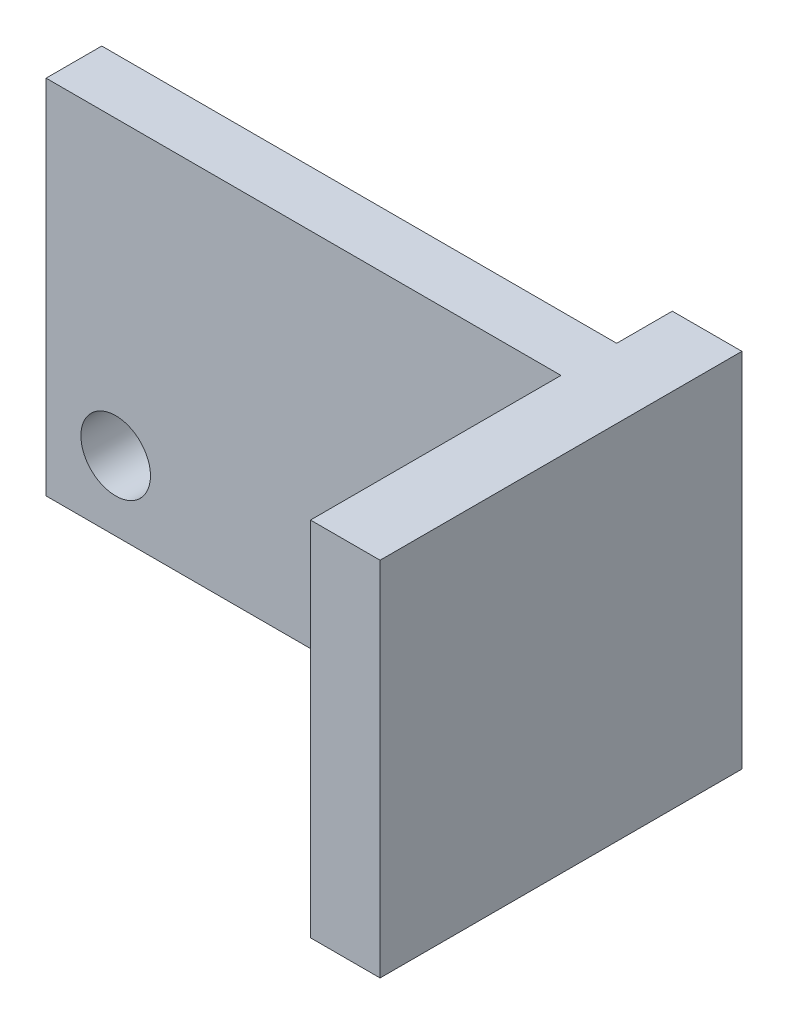
ISO-10303-21;
HEADER;
FILE_DESCRIPTION(('STEP AP214'),'2;1');
FILE_NAME('part.step','',(''),(''),'','','');
FILE_SCHEMA(('AUTOMOTIVE_DESIGN { 1 0 10303 214 1 1 1 1 }'));
ENDSEC;
DATA;
#1=APPLICATION_CONTEXT('core data for automotive mechanical design processes');
#2=APPLICATION_PROTOCOL_DEFINITION('international standard','automotive_design',2000,#1);
#3=PRODUCT_CONTEXT('',#1,'mechanical');
#4=PRODUCT('Part','Part','',(#3));
#5=PRODUCT_RELATED_PRODUCT_CATEGORY('part','',(#4));
#6=PRODUCT_DEFINITION_FORMATION('','',#4);
#7=PRODUCT_DEFINITION_CONTEXT('part definition',#1,'design');
#8=PRODUCT_DEFINITION('design','',#6,#7);
#9=PRODUCT_DEFINITION_SHAPE('','',#8);
#10=(LENGTH_UNIT() NAMED_UNIT(*) SI_UNIT(.MILLI.,.METRE.));
#11=(NAMED_UNIT(*) PLANE_ANGLE_UNIT() SI_UNIT($,.RADIAN.));
#12=(NAMED_UNIT(*) SI_UNIT($,.STERADIAN.) SOLID_ANGLE_UNIT());
#13=UNCERTAINTY_MEASURE_WITH_UNIT(LENGTH_MEASURE(1.E-05),#10,'distance_accuracy_value','');
#14=(GEOMETRIC_REPRESENTATION_CONTEXT(3) GLOBAL_UNCERTAINTY_ASSIGNED_CONTEXT((#13)) GLOBAL_UNIT_ASSIGNED_CONTEXT((#10,
#11,#12)) REPRESENTATION_CONTEXT('',''));
#15=CARTESIAN_POINT('',(0.,0.,0.));
#16=DIRECTION('',(0.,0.,1.));
#17=DIRECTION('',(1.,0.,0.));
#18=AXIS2_PLACEMENT_3D('',#15,#16,#17);
#19=CARTESIAN_POINT('',(0.,0.,2.));
#20=DIRECTION('',(1.,0.,0.));
#21=DIRECTION('',(0.,0.,-1.));
#22=AXIS2_PLACEMENT_3D('',#19,#20,#21);
#23=PLANE('',#22);
#24=DIRECTION('',(0.,-1.,0.));
#25=VECTOR('',#24,1.);
#26=CARTESIAN_POINT('',(0.,0.,0.));
#27=LINE('',#26,#25);
#28=CARTESIAN_POINT('',(0.,13.,0.));
#29=VERTEX_POINT('',#28);
#30=CARTESIAN_POINT('',(0.,0.,0.));
#31=VERTEX_POINT('',#30);
#32=EDGE_CURVE('E142',#29,#31,#27,.T.);
#33=ORIENTED_EDGE('',*,*,#32,.T.);
#34=DIRECTION('',(0.,0.,-1.));
#35=VECTOR('',#34,1.);
#36=CARTESIAN_POINT('',(0.,0.,2.));
#37=LINE('',#36,#35);
#38=CARTESIAN_POINT('',(0.,0.,2.));
#39=VERTEX_POINT('',#38);
#40=EDGE_CURVE('E40',#39,#31,#37,.T.);
#41=ORIENTED_EDGE('',*,*,#40,.F.);
#42=DIRECTION('',(0.,-1.,0.));
#43=VECTOR('',#42,1.);
#44=CARTESIAN_POINT('',(0.,0.,2.));
#45=LINE('',#44,#43);
#46=CARTESIAN_POINT('',(0.,13.,2.));
#47=VERTEX_POINT('',#46);
#48=EDGE_CURVE('E145',#47,#39,#45,.T.);
#49=ORIENTED_EDGE('',*,*,#48,.F.);
#50=DIRECTION('',(0.,0.,-1.));
#51=VECTOR('',#50,1.);
#52=CARTESIAN_POINT('',(0.,13.,2.));
#53=LINE('',#52,#51);
#54=EDGE_CURVE('E151',#47,#29,#53,.T.);
#55=ORIENTED_EDGE('',*,*,#54,.T.);
#56=EDGE_LOOP('',(#33,#41,#49,#55));
#57=FACE_BOUND('',#56,.T.);
#58=ADVANCED_FACE('F33',(#57),#23,.F.);
#59=CARTESIAN_POINT('',(0.,0.,2.));
#60=DIRECTION('',(0.,1.,0.));
#61=DIRECTION('',(0.,0.,1.));
#62=AXIS2_PLACEMENT_3D('',#59,#60,#61);
#63=PLANE('',#62);
#64=DIRECTION('',(1.,0.,0.));
#65=VECTOR('',#64,1.);
#66=CARTESIAN_POINT('',(0.,0.,0.));
#67=LINE('',#66,#65);
#68=CARTESIAN_POINT('',(18.5,0.,0.));
#69=VERTEX_POINT('',#68);
#70=EDGE_CURVE('E154',#31,#69,#67,.T.);
#71=ORIENTED_EDGE('',*,*,#70,.T.);
#72=DIRECTION('',(0.,0.,1.));
#73=VECTOR('',#72,1.);
#74=CARTESIAN_POINT('',(18.5,0.,-2.));
#75=LINE('',#74,#73);
#76=CARTESIAN_POINT('',(18.5,0.,-2.));
#77=VERTEX_POINT('',#76);
#78=EDGE_CURVE('E101',#77,#69,#75,.T.);
#79=ORIENTED_EDGE('',*,*,#78,.F.);
#80=DIRECTION('',(1.,0.,0.));
#81=VECTOR('',#80,1.);
#82=CARTESIAN_POINT('',(18.5,0.,-2.));
#83=LINE('',#82,#81);
#84=CARTESIAN_POINT('',(21.,0.,-2.));
#85=VERTEX_POINT('',#84);
#86=EDGE_CURVE('E126',#77,#85,#83,.T.);
#87=ORIENTED_EDGE('',*,*,#86,.T.);
#88=DIRECTION('',(0.,0.,-1.));
#89=VECTOR('',#88,1.);
#90=CARTESIAN_POINT('',(21.,0.,2.));
#91=LINE('',#90,#89);
#92=CARTESIAN_POINT('',(21.,0.,11.));
#93=VERTEX_POINT('',#92);
#94=EDGE_CURVE('E109',#93,#85,#91,.T.);
#95=ORIENTED_EDGE('',*,*,#94,.F.);
#96=DIRECTION('',(1.,0.,0.));
#97=VECTOR('',#96,1.);
#98=CARTESIAN_POINT('',(18.5,0.,11.));
#99=LINE('',#98,#97);
#100=CARTESIAN_POINT('',(18.5,0.,11.));
#101=VERTEX_POINT('',#100);
#102=EDGE_CURVE('E105',#101,#93,#99,.T.);
#103=ORIENTED_EDGE('',*,*,#102,.F.);
#104=CARTESIAN_POINT('',(18.5,0.,2.));
#105=VERTEX_POINT('',#104);
#106=EDGE_CURVE('E94',#105,#101,#75,.T.);
#107=ORIENTED_EDGE('',*,*,#106,.F.);
#108=DIRECTION('',(1.,0.,0.));
#109=VECTOR('',#108,1.);
#110=CARTESIAN_POINT('',(0.,0.,2.));
#111=LINE('',#110,#109);
#112=EDGE_CURVE('E52',#39,#105,#111,.T.);
#113=ORIENTED_EDGE('',*,*,#112,.F.);
#114=ORIENTED_EDGE('',*,*,#40,.T.);
#115=EDGE_LOOP('',(#71,#79,#87,#95,#103,#107,#113,#114));
#116=FACE_BOUND('',#115,.T.);
#117=ADVANCED_FACE('F107',(#116),#63,.F.);
#118=CARTESIAN_POINT('',(21.,0.,2.));
#119=DIRECTION('',(-1.,0.,0.));
#120=DIRECTION('',(0.,0.,1.));
#121=AXIS2_PLACEMENT_3D('',#118,#119,#120);
#122=PLANE('',#121);
#123=ORIENTED_EDGE('',*,*,#94,.T.);
#124=DIRECTION('',(0.,1.,0.));
#125=VECTOR('',#124,1.);
#126=CARTESIAN_POINT('',(21.,13.,-2.));
#127=LINE('',#126,#125);
#128=CARTESIAN_POINT('',(21.,13.,-2.));
#129=VERTEX_POINT('',#128);
#130=EDGE_CURVE('E128',#85,#129,#127,.T.);
#131=ORIENTED_EDGE('',*,*,#130,.T.);
#132=DIRECTION('',(0.,0.,-1.));
#133=VECTOR('',#132,1.);
#134=CARTESIAN_POINT('',(21.,13.,2.));
#135=LINE('',#134,#133);
#136=CARTESIAN_POINT('',(21.,13.,11.));
#137=VERTEX_POINT('',#136);
#138=EDGE_CURVE('E159',#137,#129,#135,.T.);
#139=ORIENTED_EDGE('',*,*,#138,.F.);
#140=DIRECTION('',(0.,1.,0.));
#141=VECTOR('',#140,1.);
#142=CARTESIAN_POINT('',(21.,13.,11.));
#143=LINE('',#142,#141);
#144=EDGE_CURVE('E113',#93,#137,#143,.T.);
#145=ORIENTED_EDGE('',*,*,#144,.F.);
#146=EDGE_LOOP('',(#123,#131,#139,#145));
#147=FACE_BOUND('',#146,.T.);
#148=ADVANCED_FACE('F183',(#147),#122,.F.);
#149=CARTESIAN_POINT('',(0.,13.,2.));
#150=DIRECTION('',(0.,-1.,0.));
#151=DIRECTION('',(0.,0.,-1.));
#152=AXIS2_PLACEMENT_3D('',#149,#150,#151);
#153=PLANE('',#152);
#154=DIRECTION('',(-1.,0.,0.));
#155=VECTOR('',#154,1.);
#156=CARTESIAN_POINT('',(0.,13.,2.));
#157=LINE('',#156,#155);
#158=CARTESIAN_POINT('',(18.5,13.,2.));
#159=VERTEX_POINT('',#158);
#160=EDGE_CURVE('E149',#159,#47,#157,.T.);
#161=ORIENTED_EDGE('',*,*,#160,.F.);
#162=DIRECTION('',(0.,0.,1.));
#163=VECTOR('',#162,1.);
#164=CARTESIAN_POINT('',(18.5,13.,-2.));
#165=LINE('',#164,#163);
#166=CARTESIAN_POINT('',(18.5,13.,11.));
#167=VERTEX_POINT('',#166);
#168=EDGE_CURVE('E135',#159,#167,#165,.T.);
#169=ORIENTED_EDGE('',*,*,#168,.T.);
#170=DIRECTION('',(-1.,0.,0.));
#171=VECTOR('',#170,1.);
#172=CARTESIAN_POINT('',(18.5,13.,11.));
#173=LINE('',#172,#171);
#174=EDGE_CURVE('E118',#137,#167,#173,.T.);
#175=ORIENTED_EDGE('',*,*,#174,.F.);
#176=ORIENTED_EDGE('',*,*,#138,.T.);
#177=DIRECTION('',(-1.,0.,0.));
#178=VECTOR('',#177,1.);
#179=CARTESIAN_POINT('',(18.5,13.,-2.));
#180=LINE('',#179,#178);
#181=CARTESIAN_POINT('',(18.5,13.,-2.));
#182=VERTEX_POINT('',#181);
#183=EDGE_CURVE('E102',#129,#182,#180,.T.);
#184=ORIENTED_EDGE('',*,*,#183,.T.);
#185=CARTESIAN_POINT('',(18.5,13.,0.));
#186=VERTEX_POINT('',#185);
#187=EDGE_CURVE('E133',#182,#186,#165,.T.);
#188=ORIENTED_EDGE('',*,*,#187,.T.);
#189=DIRECTION('',(-1.,0.,0.));
#190=VECTOR('',#189,1.);
#191=CARTESIAN_POINT('',(0.,13.,0.));
#192=LINE('',#191,#190);
#193=EDGE_CURVE('E147',#186,#29,#192,.T.);
#194=ORIENTED_EDGE('',*,*,#193,.T.);
#195=ORIENTED_EDGE('',*,*,#54,.F.);
#196=EDGE_LOOP('',(#161,#169,#175,#176,#184,#188,#194,#195));
#197=FACE_BOUND('',#196,.T.);
#198=ADVANCED_FACE('F176',(#197),#153,.F.);
#199=CARTESIAN_POINT('',(0.,0.,2.));
#200=DIRECTION('',(0.,0.,-1.));
#201=DIRECTION('',(-1.,0.,0.));
#202=AXIS2_PLACEMENT_3D('',#199,#200,#201);
#203=PLANE('',#202);
#204=CARTESIAN_POINT('',(2.5,2.5,2.));
#205=DIRECTION('',(0.,0.,1.));
#206=DIRECTION('',(1.,0.,0.));
#207=AXIS2_PLACEMENT_3D('',#204,#205,#206);
#208=CIRCLE('',#207,1.25);
#209=CARTESIAN_POINT('',(3.75,2.5,2.));
#210=VERTEX_POINT('',#209);
#211=EDGE_CURVE('E138',#210,#210,#208,.T.);
#212=ORIENTED_EDGE('',*,*,#211,.F.);
#213=EDGE_LOOP('',(#212));
#214=FACE_BOUND('',#213,.T.);
#215=ORIENTED_EDGE('',*,*,#112,.T.);
#216=DIRECTION('',(0.,1.,0.));
#217=VECTOR('',#216,1.);
#218=CARTESIAN_POINT('',(18.5,0.,2.));
#219=LINE('',#218,#217);
#220=EDGE_CURVE('E47',#105,#159,#219,.T.);
#221=ORIENTED_EDGE('',*,*,#220,.T.);
#222=ORIENTED_EDGE('',*,*,#160,.T.);
#223=ORIENTED_EDGE('',*,*,#48,.T.);
#224=EDGE_LOOP('',(#215,#221,#222,#223));
#225=FACE_BOUND('',#224,.T.);
#226=ADVANCED_FACE('F184',(#214,#225),#203,.F.);
#227=CARTESIAN_POINT('',(0.,0.,0.));
#228=DIRECTION('',(0.,0.,-1.));
#229=DIRECTION('',(-1.,0.,0.));
#230=AXIS2_PLACEMENT_3D('',#227,#228,#229);
#231=PLANE('',#230);
#232=DIRECTION('',(0.,1.,0.));
#233=VECTOR('',#232,1.);
#234=CARTESIAN_POINT('',(18.5,0.,0.));
#235=LINE('',#234,#233);
#236=EDGE_CURVE('E11',#69,#186,#235,.T.);
#237=ORIENTED_EDGE('',*,*,#236,.F.);
#238=ORIENTED_EDGE('',*,*,#70,.F.);
#239=ORIENTED_EDGE('',*,*,#32,.F.);
#240=ORIENTED_EDGE('',*,*,#193,.F.);
#241=EDGE_LOOP('',(#237,#238,#239,#240));
#242=FACE_BOUND('',#241,.T.);
#243=CARTESIAN_POINT('',(2.5,2.5,0.));
#244=DIRECTION('',(0.,0.,1.));
#245=DIRECTION('',(1.,0.,0.));
#246=AXIS2_PLACEMENT_3D('',#243,#244,#245);
#247=CIRCLE('',#246,1.25);
#248=CARTESIAN_POINT('',(3.75,2.5,0.));
#249=VERTEX_POINT('',#248);
#250=EDGE_CURVE('E139',#249,#249,#247,.T.);
#251=ORIENTED_EDGE('',*,*,#250,.T.);
#252=EDGE_LOOP('',(#251));
#253=FACE_BOUND('',#252,.T.);
#254=ADVANCED_FACE('F170',(#242,#253),#231,.T.);
#255=CARTESIAN_POINT('',(2.5,2.5,0.));
#256=DIRECTION('',(0.,0.,1.));
#257=DIRECTION('',(1.,0.,0.));
#258=AXIS2_PLACEMENT_3D('',#255,#256,#257);
#259=CYLINDRICAL_SURFACE('',#258,1.25);
#260=ORIENTED_EDGE('',*,*,#250,.F.);
#261=EDGE_LOOP('',(#260));
#262=FACE_BOUND('',#261,.T.);
#263=ORIENTED_EDGE('',*,*,#211,.T.);
#264=EDGE_LOOP('',(#263));
#265=FACE_BOUND('',#264,.T.);
#266=ADVANCED_FACE('F192',(#262,#265),#259,.F.);
#267=CARTESIAN_POINT('',(0.,0.,-2.));
#268=DIRECTION('',(0.,0.,1.));
#269=DIRECTION('',(1.,0.,0.));
#270=AXIS2_PLACEMENT_3D('',#267,#268,#269);
#271=PLANE('',#270);
#272=DIRECTION('',(0.,-1.,0.));
#273=VECTOR('',#272,1.);
#274=CARTESIAN_POINT('',(18.5,13.,-2.));
#275=LINE('',#274,#273);
#276=EDGE_CURVE('E123',#182,#77,#275,.T.);
#277=ORIENTED_EDGE('',*,*,#276,.F.);
#278=ORIENTED_EDGE('',*,*,#183,.F.);
#279=ORIENTED_EDGE('',*,*,#130,.F.);
#280=ORIENTED_EDGE('',*,*,#86,.F.);
#281=EDGE_LOOP('',(#277,#278,#279,#280));
#282=FACE_BOUND('',#281,.T.);
#283=ADVANCED_FACE('F180',(#282),#271,.F.);
#284=CARTESIAN_POINT('',(18.5,13.,-2.));
#285=DIRECTION('',(-1.,0.,0.));
#286=DIRECTION('',(0.,0.,1.));
#287=AXIS2_PLACEMENT_3D('',#284,#285,#286);
#288=PLANE('',#287);
#289=ORIENTED_EDGE('',*,*,#78,.T.);
#290=ORIENTED_EDGE('',*,*,#236,.T.);
#291=ORIENTED_EDGE('',*,*,#187,.F.);
#292=ORIENTED_EDGE('',*,*,#276,.T.);
#293=EDGE_LOOP('',(#289,#290,#291,#292));
#294=FACE_BOUND('',#293,.T.);
#295=ADVANCED_FACE('F173',(#294),#288,.T.);
#296=ORIENTED_EDGE('',*,*,#220,.F.);
#297=ORIENTED_EDGE('',*,*,#106,.T.);
#298=DIRECTION('',(0.,-1.,0.));
#299=VECTOR('',#298,1.);
#300=CARTESIAN_POINT('',(18.5,13.,11.));
#301=LINE('',#300,#299);
#302=EDGE_CURVE('E99',#167,#101,#301,.T.);
#303=ORIENTED_EDGE('',*,*,#302,.F.);
#304=ORIENTED_EDGE('',*,*,#168,.F.);
#305=EDGE_LOOP('',(#296,#297,#303,#304));
#306=FACE_BOUND('',#305,.T.);
#307=ADVANCED_FACE('F96',(#306),#288,.T.);
#308=CARTESIAN_POINT('',(0.,0.,11.));
#309=DIRECTION('',(0.,0.,1.));
#310=DIRECTION('',(1.,0.,0.));
#311=AXIS2_PLACEMENT_3D('',#308,#309,#310);
#312=PLANE('',#311);
#313=ORIENTED_EDGE('',*,*,#302,.T.);
#314=ORIENTED_EDGE('',*,*,#102,.T.);
#315=ORIENTED_EDGE('',*,*,#144,.T.);
#316=ORIENTED_EDGE('',*,*,#174,.T.);
#317=EDGE_LOOP('',(#313,#314,#315,#316));
#318=FACE_BOUND('',#317,.T.);
#319=ADVANCED_FACE('F116',(#318),#312,.T.);
#320=CLOSED_SHELL('',(#58,#117,#148,#198,#226,#254,#266,#283,#295,#307,#319));
#321=MANIFOLD_SOLID_BREP('B2',#320);
#322=ADVANCED_BREP_SHAPE_REPRESENTATION('',(#18,#321),#14);
#323=SHAPE_DEFINITION_REPRESENTATION(#9,#322);
ENDSEC;
END-ISO-10303-21;
